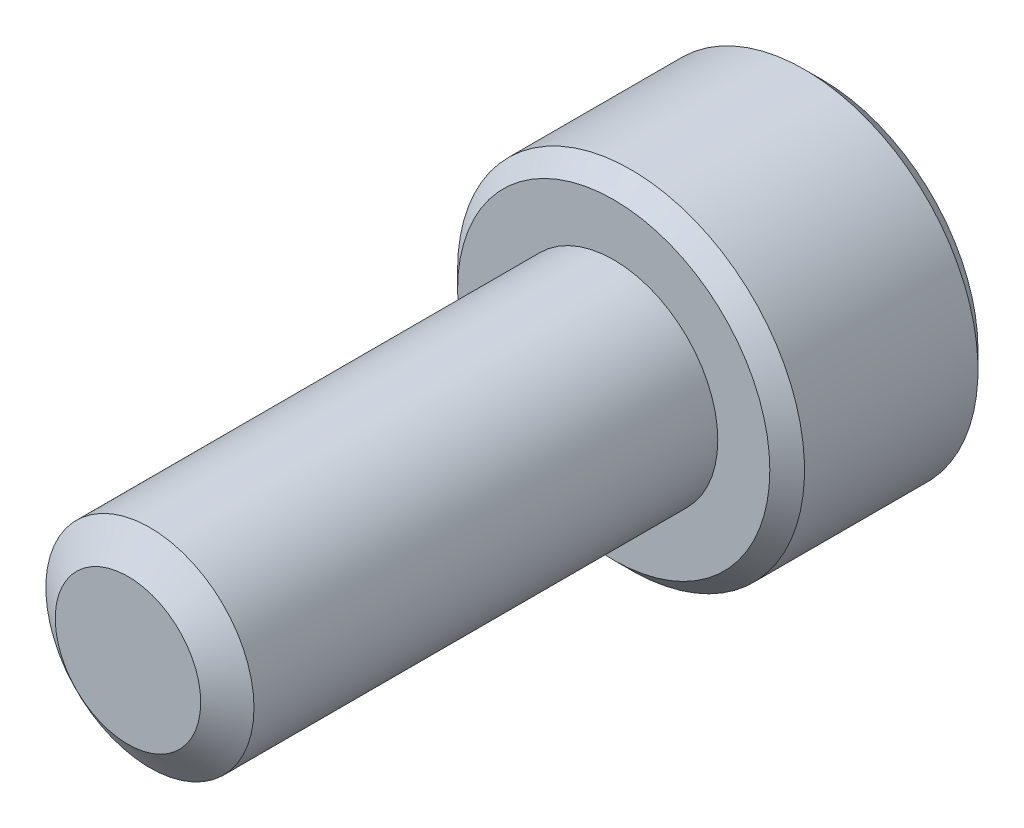
ISO-10303-21;
HEADER;
FILE_DESCRIPTION(('STEP AP214'),'2;1');
FILE_NAME('part.step','',(''),(''),'','','');
FILE_SCHEMA(('AUTOMOTIVE_DESIGN { 1 0 10303 214 1 1 1 1 }'));
ENDSEC;
DATA;
#1=APPLICATION_CONTEXT('core data for automotive mechanical design processes');
#2=APPLICATION_PROTOCOL_DEFINITION('international standard','automotive_design',2000,#1);
#3=PRODUCT_CONTEXT('',#1,'mechanical');
#4=PRODUCT('Part','Part','',(#3));
#5=PRODUCT_RELATED_PRODUCT_CATEGORY('part','',(#4));
#6=PRODUCT_DEFINITION_FORMATION('','',#4);
#7=PRODUCT_DEFINITION_CONTEXT('part definition',#1,'design');
#8=PRODUCT_DEFINITION('design','',#6,#7);
#9=PRODUCT_DEFINITION_SHAPE('','',#8);
#10=(LENGTH_UNIT() NAMED_UNIT(*) SI_UNIT(.MILLI.,.METRE.));
#11=(NAMED_UNIT(*) PLANE_ANGLE_UNIT() SI_UNIT($,.RADIAN.));
#12=(NAMED_UNIT(*) SI_UNIT($,.STERADIAN.) SOLID_ANGLE_UNIT());
#13=UNCERTAINTY_MEASURE_WITH_UNIT(LENGTH_MEASURE(1.E-05),#10,'distance_accuracy_value','');
#14=(GEOMETRIC_REPRESENTATION_CONTEXT(3) GLOBAL_UNCERTAINTY_ASSIGNED_CONTEXT((#13)) GLOBAL_UNIT_ASSIGNED_CONTEXT((#10,
#11,#12)) REPRESENTATION_CONTEXT('',''));
#15=CARTESIAN_POINT('',(0.,0.,0.));
#16=DIRECTION('',(0.,0.,1.));
#17=DIRECTION('',(1.,0.,0.));
#18=AXIS2_PLACEMENT_3D('',#15,#16,#17);
#19=CARTESIAN_POINT('',(0.,0.,-14.));
#20=DIRECTION('',(0.,0.,1.));
#21=DIRECTION('',(1.,0.,0.));
#22=AXIS2_PLACEMENT_3D('',#19,#20,#21);
#23=CYLINDRICAL_SURFACE('',#22,3.);
#24=CARTESIAN_POINT('',(0.,0.,-14.));
#25=DIRECTION('',(0.,0.,-1.));
#26=DIRECTION('',(-1.,0.,0.));
#27=AXIS2_PLACEMENT_3D('',#24,#25,#26);
#28=CIRCLE('',#27,3.);
#29=CARTESIAN_POINT('',(-3.,0.,-14.));
#30=VERTEX_POINT('',#29);
#31=EDGE_CURVE('E154',#30,#30,#28,.F.);
#32=ORIENTED_EDGE('',*,*,#31,.T.);
#33=EDGE_LOOP('',(#32));
#34=FACE_BOUND('',#33,.T.);
#35=CARTESIAN_POINT('',(0.,0.,-0.632650851713494));
#36=DIRECTION('',(0.,0.,1.));
#37=DIRECTION('',(1.,0.,0.));
#38=AXIS2_PLACEMENT_3D('',#35,#36,#37);
#39=CIRCLE('',#38,3.);
#40=CARTESIAN_POINT('',(3.,0.,-0.632650851713494));
#41=VERTEX_POINT('',#40);
#42=EDGE_CURVE('E171',#41,#41,#39,.T.);
#43=ORIENTED_EDGE('',*,*,#42,.F.);
#44=EDGE_LOOP('',(#43));
#45=FACE_BOUND('',#44,.T.);
#46=ADVANCED_FACE('F39',(#34,#45),#23,.T.);
#47=CARTESIAN_POINT('',(0.,0.,0.));
#48=DIRECTION('',(0.,0.,-1.));
#49=DIRECTION('',(-1.,0.,0.));
#50=AXIS2_PLACEMENT_3D('',#47,#48,#49);
#51=CONICAL_SURFACE('',#50,2.09648094716167,0.959931088596884);
#52=ORIENTED_EDGE('',*,*,#42,.T.);
#53=EDGE_LOOP('',(#52));
#54=FACE_BOUND('',#53,.T.);
#55=CARTESIAN_POINT('',(0.,0.,0.));
#56=DIRECTION('',(0.,0.,1.));
#57=DIRECTION('',(1.,0.,0.));
#58=AXIS2_PLACEMENT_3D('',#55,#56,#57);
#59=CIRCLE('',#58,2.09648094716167);
#60=CARTESIAN_POINT('',(2.09648094716167,0.,0.));
#61=VERTEX_POINT('',#60);
#62=EDGE_CURVE('E167',#61,#61,#59,.T.);
#63=ORIENTED_EDGE('',*,*,#62,.F.);
#64=EDGE_LOOP('',(#63));
#65=FACE_BOUND('',#64,.T.);
#66=ADVANCED_FACE('F220',(#54,#65),#51,.T.);
#67=CARTESIAN_POINT('',(0.,0.,0.));
#68=DIRECTION('',(0.,0.,1.));
#69=DIRECTION('',(1.,0.,0.));
#70=AXIS2_PLACEMENT_3D('',#67,#68,#69);
#71=PLANE('',#70);
#72=ORIENTED_EDGE('',*,*,#62,.T.);
#73=EDGE_LOOP('',(#72));
#74=FACE_BOUND('',#73,.T.);
#75=ADVANCED_FACE('F226',(#74),#71,.T.);
#76=CARTESIAN_POINT('',(0.,0.,-20.));
#77=DIRECTION('',(0.,0.,1.));
#78=DIRECTION('',(1.,0.,0.));
#79=AXIS2_PLACEMENT_3D('',#76,#77,#78);
#80=CYLINDRICAL_SURFACE('',#79,5.);
#81=CARTESIAN_POINT('',(0.,0.,-19.5));
#82=DIRECTION('',(0.,0.,-1.));
#83=DIRECTION('',(-1.,0.,0.));
#84=AXIS2_PLACEMENT_3D('',#81,#82,#83);
#85=CIRCLE('',#84,5.);
#86=CARTESIAN_POINT('',(-5.,0.,-19.5));
#87=VERTEX_POINT('',#86);
#88=EDGE_CURVE('E48',#87,#87,#85,.F.);
#89=ORIENTED_EDGE('',*,*,#88,.T.);
#90=EDGE_LOOP('',(#89));
#91=FACE_BOUND('',#90,.T.);
#92=CARTESIAN_POINT('',(0.,0.,-14.5));
#93=DIRECTION('',(0.,0.,-1.));
#94=DIRECTION('',(-1.,0.,0.));
#95=AXIS2_PLACEMENT_3D('',#92,#93,#94);
#96=CIRCLE('',#95,5.);
#97=CARTESIAN_POINT('',(-5.,0.,-14.5));
#98=VERTEX_POINT('',#97);
#99=EDGE_CURVE('E179',#98,#98,#96,.T.);
#100=ORIENTED_EDGE('',*,*,#99,.T.);
#101=EDGE_LOOP('',(#100));
#102=FACE_BOUND('',#101,.T.);
#103=ADVANCED_FACE('F186',(#91,#102),#80,.T.);
#104=CARTESIAN_POINT('',(0.,0.,-20.));
#105=DIRECTION('',(0.,0.,-1.));
#106=DIRECTION('',(-1.,0.,0.));
#107=AXIS2_PLACEMENT_3D('',#104,#105,#106);
#108=PLANE('',#107);
#109=CARTESIAN_POINT('',(0.,0.,-20.));
#110=DIRECTION('',(0.,0.,-1.));
#111=DIRECTION('',(-1.,0.,0.));
#112=AXIS2_PLACEMENT_3D('',#109,#110,#111);
#113=CIRCLE('',#112,4.5);
#114=CARTESIAN_POINT('',(-4.5,0.,-20.));
#115=VERTEX_POINT('',#114);
#116=EDGE_CURVE('E175',#115,#115,#113,.T.);
#117=ORIENTED_EDGE('',*,*,#116,.T.);
#118=EDGE_LOOP('',(#117));
#119=FACE_BOUND('',#118,.T.);
#120=DIRECTION('',(0.866025403784439,0.5,0.));
#121=VECTOR('',#120,1.);
#122=CARTESIAN_POINT('',(-2.5,1.44337567297406,-20.));
#123=LINE('',#122,#121);
#124=CARTESIAN_POINT('',(-2.5,1.44337567297406,-20.));
#125=VERTEX_POINT('',#124);
#126=CARTESIAN_POINT('',(0.,2.88675134594813,-20.));
#127=VERTEX_POINT('',#126);
#128=EDGE_CURVE('E55',#125,#127,#123,.T.);
#129=ORIENTED_EDGE('',*,*,#128,.F.);
#130=DIRECTION('',(0.,1.,0.));
#131=VECTOR('',#130,1.);
#132=CARTESIAN_POINT('',(-2.5,-1.44337567297406,-20.));
#133=LINE('',#132,#131);
#134=CARTESIAN_POINT('',(-2.5,-1.44337567297406,-20.));
#135=VERTEX_POINT('',#134);
#136=EDGE_CURVE('E148',#135,#125,#133,.T.);
#137=ORIENTED_EDGE('',*,*,#136,.F.);
#138=DIRECTION('',(-0.866025403784439,0.5,0.));
#139=VECTOR('',#138,1.);
#140=CARTESIAN_POINT('',(0.,-2.88675134594813,-20.));
#141=LINE('',#140,#139);
#142=CARTESIAN_POINT('',(0.,-2.88675134594813,-20.));
#143=VERTEX_POINT('',#142);
#144=EDGE_CURVE('E145',#143,#135,#141,.T.);
#145=ORIENTED_EDGE('',*,*,#144,.F.);
#146=DIRECTION('',(-0.866025403784439,-0.5,0.));
#147=VECTOR('',#146,1.);
#148=CARTESIAN_POINT('',(2.5,-1.44337567297407,-20.));
#149=LINE('',#148,#147);
#150=CARTESIAN_POINT('',(2.5,-1.44337567297407,-20.));
#151=VERTEX_POINT('',#150);
#152=EDGE_CURVE('E103',#151,#143,#149,.T.);
#153=ORIENTED_EDGE('',*,*,#152,.F.);
#154=DIRECTION('',(0.,-1.,0.));
#155=VECTOR('',#154,1.);
#156=CARTESIAN_POINT('',(2.5,1.44337567297406,-20.));
#157=LINE('',#156,#155);
#158=CARTESIAN_POINT('',(2.5,1.44337567297406,-20.));
#159=VERTEX_POINT('',#158);
#160=EDGE_CURVE('E139',#159,#151,#157,.T.);
#161=ORIENTED_EDGE('',*,*,#160,.F.);
#162=DIRECTION('',(0.866025403784439,-0.5,0.));
#163=VECTOR('',#162,1.);
#164=CARTESIAN_POINT('',(0.,2.88675134594813,-20.));
#165=LINE('',#164,#163);
#166=EDGE_CURVE('E135',#127,#159,#165,.T.);
#167=ORIENTED_EDGE('',*,*,#166,.F.);
#168=EDGE_LOOP('',(#129,#137,#145,#153,#161,#167));
#169=FACE_BOUND('',#168,.T.);
#170=ADVANCED_FACE('F194',(#119,#169),#108,.T.);
#171=CARTESIAN_POINT('',(0.,0.,-14.));
#172=DIRECTION('',(0.,0.,-1.));
#173=DIRECTION('',(-1.,0.,0.));
#174=AXIS2_PLACEMENT_3D('',#171,#172,#173);
#175=PLANE('',#174);
#176=CARTESIAN_POINT('',(0.,0.,-14.));
#177=DIRECTION('',(0.,0.,-1.));
#178=DIRECTION('',(-1.,0.,0.));
#179=AXIS2_PLACEMENT_3D('',#176,#177,#178);
#180=CIRCLE('',#179,4.5);
#181=CARTESIAN_POINT('',(-4.5,0.,-14.));
#182=VERTEX_POINT('',#181);
#183=EDGE_CURVE('E11',#182,#182,#180,.F.);
#184=ORIENTED_EDGE('',*,*,#183,.T.);
#185=EDGE_LOOP('',(#184));
#186=FACE_BOUND('',#185,.T.);
#187=ORIENTED_EDGE('',*,*,#31,.F.);
#188=EDGE_LOOP('',(#187));
#189=FACE_BOUND('',#188,.T.);
#190=ADVANCED_FACE('F197',(#186,#189),#175,.F.);
#191=CARTESIAN_POINT('',(-2.5,1.44337567297406,-16.25));
#192=DIRECTION('',(-0.5,0.866025403784439,0.));
#193=DIRECTION('',(-0.866025403784439,-0.5,0.));
#194=AXIS2_PLACEMENT_3D('',#191,#192,#193);
#195=PLANE('',#194);
#196=ORIENTED_EDGE('',*,*,#128,.T.);
#197=DIRECTION('',(0.,0.,-1.));
#198=VECTOR('',#197,1.);
#199=CARTESIAN_POINT('',(0.,2.88675134594813,-16.25));
#200=LINE('',#199,#198);
#201=CARTESIAN_POINT('',(0.,2.88675134594813,-16.25));
#202=VERTEX_POINT('',#201);
#203=EDGE_CURVE('E85',#202,#127,#200,.T.);
#204=ORIENTED_EDGE('',*,*,#203,.F.);
#205=DIRECTION('',(0.866025403784439,0.5,0.));
#206=VECTOR('',#205,1.);
#207=CARTESIAN_POINT('',(-2.5,1.44337567297406,-16.25));
#208=LINE('',#207,#206);
#209=CARTESIAN_POINT('',(-2.5,1.44337567297406,-16.25));
#210=VERTEX_POINT('',#209);
#211=EDGE_CURVE('E151',#210,#202,#208,.T.);
#212=ORIENTED_EDGE('',*,*,#211,.F.);
#213=DIRECTION('',(0.,0.,-1.));
#214=VECTOR('',#213,1.);
#215=CARTESIAN_POINT('',(-2.5,1.44337567297406,-16.25));
#216=LINE('',#215,#214);
#217=EDGE_CURVE('E63',#210,#125,#216,.T.);
#218=ORIENTED_EDGE('',*,*,#217,.T.);
#219=EDGE_LOOP('',(#196,#204,#212,#218));
#220=FACE_BOUND('',#219,.T.);
#221=ADVANCED_FACE('F207',(#220),#195,.F.);
#222=CARTESIAN_POINT('',(-2.5,-1.44337567297406,-16.25));
#223=DIRECTION('',(-1.,0.,0.));
#224=DIRECTION('',(0.,-1.,0.));
#225=AXIS2_PLACEMENT_3D('',#222,#223,#224);
#226=PLANE('',#225);
#227=ORIENTED_EDGE('',*,*,#136,.T.);
#228=ORIENTED_EDGE('',*,*,#217,.F.);
#229=DIRECTION('',(0.,1.,0.));
#230=VECTOR('',#229,1.);
#231=CARTESIAN_POINT('',(-2.5,-1.44337567297406,-16.25));
#232=LINE('',#231,#230);
#233=CARTESIAN_POINT('',(-2.5,-1.44337567297406,-16.25));
#234=VERTEX_POINT('',#233);
#235=EDGE_CURVE('E117',#234,#210,#232,.T.);
#236=ORIENTED_EDGE('',*,*,#235,.F.);
#237=DIRECTION('',(0.,0.,-1.));
#238=VECTOR('',#237,1.);
#239=CARTESIAN_POINT('',(-2.5,-1.44337567297406,-16.25));
#240=LINE('',#239,#238);
#241=EDGE_CURVE('E108',#234,#135,#240,.T.);
#242=ORIENTED_EDGE('',*,*,#241,.T.);
#243=EDGE_LOOP('',(#227,#228,#236,#242));
#244=FACE_BOUND('',#243,.T.);
#245=ADVANCED_FACE('F209',(#244),#226,.F.);
#246=CARTESIAN_POINT('',(0.,-2.88675134594813,-16.25));
#247=DIRECTION('',(-0.5,-0.866025403784439,0.));
#248=DIRECTION('',(0.866025403784439,-0.5,0.));
#249=AXIS2_PLACEMENT_3D('',#246,#247,#248);
#250=PLANE('',#249);
#251=ORIENTED_EDGE('',*,*,#144,.T.);
#252=ORIENTED_EDGE('',*,*,#241,.F.);
#253=DIRECTION('',(-0.866025403784439,0.5,0.));
#254=VECTOR('',#253,1.);
#255=CARTESIAN_POINT('',(0.,-2.88675134594813,-16.25));
#256=LINE('',#255,#254);
#257=CARTESIAN_POINT('',(0.,-2.88675134594813,-16.25));
#258=VERTEX_POINT('',#257);
#259=EDGE_CURVE('E112',#258,#234,#256,.T.);
#260=ORIENTED_EDGE('',*,*,#259,.F.);
#261=DIRECTION('',(0.,0.,-1.));
#262=VECTOR('',#261,1.);
#263=CARTESIAN_POINT('',(0.,-2.88675134594813,-16.25));
#264=LINE('',#263,#262);
#265=EDGE_CURVE('E96',#258,#143,#264,.T.);
#266=ORIENTED_EDGE('',*,*,#265,.T.);
#267=EDGE_LOOP('',(#251,#252,#260,#266));
#268=FACE_BOUND('',#267,.T.);
#269=ADVANCED_FACE('F113',(#268),#250,.F.);
#270=CARTESIAN_POINT('',(2.5,-1.44337567297407,-16.25));
#271=DIRECTION('',(0.5,-0.866025403784439,0.));
#272=DIRECTION('',(0.866025403784439,0.5,0.));
#273=AXIS2_PLACEMENT_3D('',#270,#271,#272);
#274=PLANE('',#273);
#275=ORIENTED_EDGE('',*,*,#152,.T.);
#276=ORIENTED_EDGE('',*,*,#265,.F.);
#277=DIRECTION('',(-0.866025403784439,-0.5,0.));
#278=VECTOR('',#277,1.);
#279=CARTESIAN_POINT('',(2.5,-1.44337567297407,-16.25));
#280=LINE('',#279,#278);
#281=CARTESIAN_POINT('',(2.5,-1.44337567297407,-16.25));
#282=VERTEX_POINT('',#281);
#283=EDGE_CURVE('E100',#282,#258,#280,.T.);
#284=ORIENTED_EDGE('',*,*,#283,.F.);
#285=DIRECTION('',(0.,0.,-1.));
#286=VECTOR('',#285,1.);
#287=CARTESIAN_POINT('',(2.5,-1.44337567297407,-16.25));
#288=LINE('',#287,#286);
#289=EDGE_CURVE('E109',#282,#151,#288,.T.);
#290=ORIENTED_EDGE('',*,*,#289,.T.);
#291=EDGE_LOOP('',(#275,#276,#284,#290));
#292=FACE_BOUND('',#291,.T.);
#293=ADVANCED_FACE('F98',(#292),#274,.F.);
#294=CARTESIAN_POINT('',(2.5,1.44337567297406,-16.25));
#295=DIRECTION('',(1.,0.,0.));
#296=DIRECTION('',(0.,0.,-1.));
#297=AXIS2_PLACEMENT_3D('',#294,#295,#296);
#298=PLANE('',#297);
#299=ORIENTED_EDGE('',*,*,#160,.T.);
#300=ORIENTED_EDGE('',*,*,#289,.F.);
#301=DIRECTION('',(0.,-1.,0.));
#302=VECTOR('',#301,1.);
#303=CARTESIAN_POINT('',(2.5,1.44337567297406,-16.25));
#304=LINE('',#303,#302);
#305=CARTESIAN_POINT('',(2.5,1.44337567297406,-16.25));
#306=VERTEX_POINT('',#305);
#307=EDGE_CURVE('E123',#306,#282,#304,.T.);
#308=ORIENTED_EDGE('',*,*,#307,.F.);
#309=DIRECTION('',(0.,0.,-1.));
#310=VECTOR('',#309,1.);
#311=CARTESIAN_POINT('',(2.5,1.44337567297406,-16.25));
#312=LINE('',#311,#310);
#313=EDGE_CURVE('E159',#306,#159,#312,.T.);
#314=ORIENTED_EDGE('',*,*,#313,.T.);
#315=EDGE_LOOP('',(#299,#300,#308,#314));
#316=FACE_BOUND('',#315,.T.);
#317=ADVANCED_FACE('F281',(#316),#298,.F.);
#318=CARTESIAN_POINT('',(0.,2.88675134594813,-16.25));
#319=DIRECTION('',(0.5,0.866025403784439,0.));
#320=DIRECTION('',(-0.866025403784439,0.5,0.));
#321=AXIS2_PLACEMENT_3D('',#318,#319,#320);
#322=PLANE('',#321);
#323=ORIENTED_EDGE('',*,*,#166,.T.);
#324=ORIENTED_EDGE('',*,*,#313,.F.);
#325=DIRECTION('',(0.866025403784439,-0.5,0.));
#326=VECTOR('',#325,1.);
#327=CARTESIAN_POINT('',(0.,2.88675134594813,-16.25));
#328=LINE('',#327,#326);
#329=EDGE_CURVE('E127',#202,#306,#328,.T.);
#330=ORIENTED_EDGE('',*,*,#329,.F.);
#331=ORIENTED_EDGE('',*,*,#203,.T.);
#332=EDGE_LOOP('',(#323,#324,#330,#331));
#333=FACE_BOUND('',#332,.T.);
#334=ADVANCED_FACE('F203',(#333),#322,.F.);
#335=CARTESIAN_POINT('',(2.5,4.33012701892219,-16.25));
#336=DIRECTION('',(0.,0.,-1.));
#337=DIRECTION('',(-1.,0.,0.));
#338=AXIS2_PLACEMENT_3D('',#335,#336,#337);
#339=PLANE('',#338);
#340=ORIENTED_EDGE('',*,*,#211,.T.);
#341=ORIENTED_EDGE('',*,*,#329,.T.);
#342=ORIENTED_EDGE('',*,*,#307,.T.);
#343=ORIENTED_EDGE('',*,*,#283,.T.);
#344=ORIENTED_EDGE('',*,*,#259,.T.);
#345=ORIENTED_EDGE('',*,*,#235,.T.);
#346=EDGE_LOOP('',(#340,#341,#342,#343,#344,#345));
#347=FACE_BOUND('',#346,.T.);
#348=ADVANCED_FACE('F120',(#347),#339,.T.);
#349=CARTESIAN_POINT('',(0.,0.,-20.));
#350=DIRECTION('',(0.,0.,1.));
#351=DIRECTION('',(1.,0.,0.));
#352=AXIS2_PLACEMENT_3D('',#349,#350,#351);
#353=CONICAL_SURFACE('',#352,4.5,0.785398163397444);
#354=ORIENTED_EDGE('',*,*,#88,.F.);
#355=EDGE_LOOP('',(#354));
#356=FACE_BOUND('',#355,.T.);
#357=ORIENTED_EDGE('',*,*,#116,.F.);
#358=EDGE_LOOP('',(#357));
#359=FACE_BOUND('',#358,.T.);
#360=ADVANCED_FACE('F189',(#356,#359),#353,.T.);
#361=CARTESIAN_POINT('',(0.,0.,-14.5));
#362=DIRECTION('',(0.,0.,-1.));
#363=DIRECTION('',(-1.,0.,0.));
#364=AXIS2_PLACEMENT_3D('',#361,#362,#363);
#365=CONICAL_SURFACE('',#364,5.,0.785398163397449);
#366=ORIENTED_EDGE('',*,*,#183,.F.);
#367=EDGE_LOOP('',(#366));
#368=FACE_BOUND('',#367,.T.);
#369=ORIENTED_EDGE('',*,*,#99,.F.);
#370=EDGE_LOOP('',(#369));
#371=FACE_BOUND('',#370,.T.);
#372=ADVANCED_FACE('F41',(#368,#371),#365,.T.);
#373=CLOSED_SHELL('',(#46,#66,#75,#103,#170,#190,#221,#245,#269,#293,#317,#334,#348,#360,#372));
#374=MANIFOLD_SOLID_BREP('B2',#373);
#375=ADVANCED_BREP_SHAPE_REPRESENTATION('',(#18,#374),#14);
#376=SHAPE_DEFINITION_REPRESENTATION(#9,#375);
ENDSEC;
END-ISO-10303-21;
